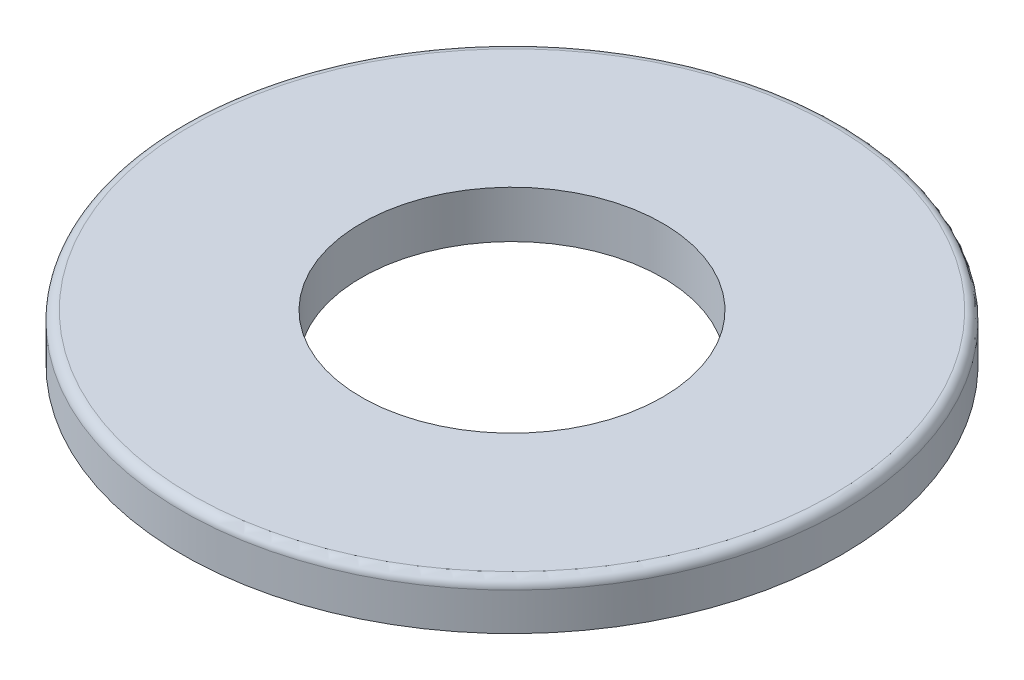
ISO-10303-21;
HEADER;
FILE_DESCRIPTION(('STEP AP214'),'2;1');
FILE_NAME('part.step','',(''),(''),'','','');
FILE_SCHEMA(('AUTOMOTIVE_DESIGN { 1 0 10303 214 1 1 1 1 }'));
ENDSEC;
DATA;
#1=APPLICATION_CONTEXT('core data for automotive mechanical design processes');
#2=APPLICATION_PROTOCOL_DEFINITION('international standard','automotive_design',2000,#1);
#3=PRODUCT_CONTEXT('',#1,'mechanical');
#4=PRODUCT('Part','Part','',(#3));
#5=PRODUCT_RELATED_PRODUCT_CATEGORY('part','',(#4));
#6=PRODUCT_DEFINITION_FORMATION('','',#4);
#7=PRODUCT_DEFINITION_CONTEXT('part definition',#1,'design');
#8=PRODUCT_DEFINITION('design','',#6,#7);
#9=PRODUCT_DEFINITION_SHAPE('','',#8);
#10=(LENGTH_UNIT() NAMED_UNIT(*) SI_UNIT(.MILLI.,.METRE.));
#11=(NAMED_UNIT(*) PLANE_ANGLE_UNIT() SI_UNIT($,.RADIAN.));
#12=(NAMED_UNIT(*) SI_UNIT($,.STERADIAN.) SOLID_ANGLE_UNIT());
#13=UNCERTAINTY_MEASURE_WITH_UNIT(LENGTH_MEASURE(1.E-05),#10,'distance_accuracy_value','');
#14=(GEOMETRIC_REPRESENTATION_CONTEXT(3) GLOBAL_UNCERTAINTY_ASSIGNED_CONTEXT((#13)) GLOBAL_UNIT_ASSIGNED_CONTEXT((#10,
#11,#12)) REPRESENTATION_CONTEXT('',''));
#15=CARTESIAN_POINT('',(0.,0.,0.));
#16=DIRECTION('',(0.,0.,1.));
#17=DIRECTION('',(1.,0.,0.));
#18=AXIS2_PLACEMENT_3D('',#15,#16,#17);
#19=CARTESIAN_POINT('',(0.,0.5,0.));
#20=DIRECTION('',(0.,-1.,0.));
#21=DIRECTION('',(0.,0.,-1.));
#22=AXIS2_PLACEMENT_3D('',#19,#20,#21);
#23=PLANE('',#22);
#24=CARTESIAN_POINT('',(0.,0.5,0.));
#25=DIRECTION('',(0.,1.,0.));
#26=DIRECTION('',(1.,0.,0.));
#27=AXIS2_PLACEMENT_3D('',#24,#25,#26);
#28=CIRCLE('',#27,1.6);
#29=CARTESIAN_POINT('',(1.6,0.5,0.));
#30=VERTEX_POINT('',#29);
#31=EDGE_CURVE('E79',#30,#30,#28,.T.);
#32=ORIENTED_EDGE('',*,*,#31,.F.);
#33=EDGE_LOOP('',(#32));
#34=FACE_BOUND('',#33,.T.);
#35=CARTESIAN_POINT('',(0.,0.5,0.));
#36=DIRECTION('',(0.,1.,0.));
#37=DIRECTION('',(-1.,0.,0.));
#38=AXIS2_PLACEMENT_3D('',#35,#36,#37);
#39=CIRCLE('',#38,3.4);
#40=CARTESIAN_POINT('',(3.39993492896805,0.5,0.0210351796524664));
#41=VERTEX_POINT('',#40);
#42=EDGE_CURVE('E11',#41,#41,#39,.T.);
#43=ORIENTED_EDGE('',*,*,#42,.T.);
#44=EDGE_LOOP('',(#43));
#45=FACE_BOUND('',#44,.T.);
#46=ADVANCED_FACE('F17',(#34,#45),#23,.F.);
#47=CARTESIAN_POINT('',(0.,0.4,0.));
#48=DIRECTION('',(0.,-1.,0.));
#49=DIRECTION('',(-0.999980861461192,0.,-0.00618681754484295));
#50=AXIS2_PLACEMENT_3D('',#47,#48,#49);
#51=TOROIDAL_SURFACE('',#50,3.4,0.1);
#52=CARTESIAN_POINT('',(0.,0.4,0.));
#53=DIRECTION('',(0.,1.,0.));
#54=DIRECTION('',(-1.,0.,0.));
#55=AXIS2_PLACEMENT_3D('',#52,#53,#54);
#56=CIRCLE('',#55,3.5);
#57=CARTESIAN_POINT('',(3.5,0.4,0.));
#58=VERTEX_POINT('',#57);
#59=CARTESIAN_POINT('',(3.49993301511417,0.4,0.0216538614069508));
#60=VERTEX_POINT('',#59);
#61=EDGE_CURVE('E86',#58,#60,#56,.T.);
#62=ORIENTED_EDGE('',*,*,#61,.T.);
#63=CARTESIAN_POINT('',(3.39993492896805,0.4,0.0210351796524664));
#64=DIRECTION('',(-0.00618681754484307,0.,0.999980861461192));
#65=DIRECTION('',(0.999980861461192,0.,0.00618681754484307));
#66=AXIS2_PLACEMENT_3D('',#63,#64,#65);
#67=CIRCLE('',#66,0.1);
#68=EDGE_CURVE('E26',#60,#41,#67,.T.);
#69=ORIENTED_EDGE('',*,*,#68,.T.);
#70=ORIENTED_EDGE('',*,*,#42,.F.);
#71=ORIENTED_EDGE('',*,*,#68,.F.);
#72=CARTESIAN_POINT('',(0.,0.4,0.));
#73=DIRECTION('',(0.,1.,0.));
#74=DIRECTION('',(-1.,0.,0.));
#75=AXIS2_PLACEMENT_3D('',#72,#73,#74);
#76=CIRCLE('',#75,3.5);
#77=EDGE_CURVE('E83',#60,#58,#76,.T.);
#78=ORIENTED_EDGE('',*,*,#77,.T.);
#79=EDGE_LOOP('',(#62,#69,#70,#71,#78));
#80=FACE_BOUND('',#79,.T.);
#81=ADVANCED_FACE('F94',(#80),#51,.T.);
#82=CARTESIAN_POINT('',(0.,0.525,0.));
#83=DIRECTION('',(0.,-1.,0.));
#84=DIRECTION('',(-1.,0.,0.));
#85=AXIS2_PLACEMENT_3D('',#82,#83,#84);
#86=CYLINDRICAL_SURFACE('',#85,3.5);
#87=CARTESIAN_POINT('',(0.,0.,0.));
#88=DIRECTION('',(0.,-1.,0.));
#89=DIRECTION('',(1.,0.,0.));
#90=AXIS2_PLACEMENT_3D('',#87,#88,#89);
#91=CIRCLE('',#90,3.5);
#92=CARTESIAN_POINT('',(3.5,0.,0.));
#93=VERTEX_POINT('',#92);
#94=EDGE_CURVE('E20',#93,#93,#91,.T.);
#95=ORIENTED_EDGE('',*,*,#94,.F.);
#96=DIRECTION('',(0.,1.,0.));
#97=VECTOR('',#96,1.);
#98=CARTESIAN_POINT('',(3.5,0.525,0.));
#99=LINE('',#98,#97);
#100=EDGE_CURVE('E60',#93,#58,#99,.T.);
#101=ORIENTED_EDGE('',*,*,#100,.T.);
#102=ORIENTED_EDGE('',*,*,#77,.F.);
#103=ORIENTED_EDGE('',*,*,#61,.F.);
#104=ORIENTED_EDGE('',*,*,#100,.F.);
#105=EDGE_LOOP('',(#95,#101,#102,#103,#104));
#106=FACE_BOUND('',#105,.T.);
#107=ADVANCED_FACE('F96',(#106),#86,.T.);
#108=CARTESIAN_POINT('',(0.,0.,0.));
#109=DIRECTION('',(0.,-1.,0.));
#110=DIRECTION('',(0.,0.,-1.));
#111=AXIS2_PLACEMENT_3D('',#108,#109,#110);
#112=PLANE('',#111);
#113=CARTESIAN_POINT('',(0.,0.,0.));
#114=DIRECTION('',(0.,-1.,0.));
#115=DIRECTION('',(1.,0.,0.));
#116=AXIS2_PLACEMENT_3D('',#113,#114,#115);
#117=CIRCLE('',#116,1.6);
#118=CARTESIAN_POINT('',(1.6,0.,0.));
#119=VERTEX_POINT('',#118);
#120=EDGE_CURVE('E67',#119,#119,#117,.T.);
#121=ORIENTED_EDGE('',*,*,#120,.F.);
#122=EDGE_LOOP('',(#121));
#123=FACE_BOUND('',#122,.T.);
#124=ORIENTED_EDGE('',*,*,#94,.T.);
#125=EDGE_LOOP('',(#124));
#126=FACE_BOUND('',#125,.T.);
#127=ADVANCED_FACE('F98',(#123,#126),#112,.T.);
#128=CARTESIAN_POINT('',(0.,0.525,0.));
#129=DIRECTION('',(0.,-1.,0.));
#130=DIRECTION('',(-1.,0.,0.));
#131=AXIS2_PLACEMENT_3D('',#128,#129,#130);
#132=CYLINDRICAL_SURFACE('',#131,1.6);
#133=ORIENTED_EDGE('',*,*,#31,.T.);
#134=DIRECTION('',(0.,-1.,0.));
#135=VECTOR('',#134,1.);
#136=CARTESIAN_POINT('',(1.6,0.525,0.));
#137=LINE('',#136,#135);
#138=EDGE_CURVE('E70',#30,#119,#137,.T.);
#139=ORIENTED_EDGE('',*,*,#138,.T.);
#140=ORIENTED_EDGE('',*,*,#120,.T.);
#141=ORIENTED_EDGE('',*,*,#138,.F.);
#142=EDGE_LOOP('',(#133,#139,#140,#141));
#143=FACE_BOUND('',#142,.T.);
#144=ADVANCED_FACE('F69',(#143),#132,.F.);
#145=CLOSED_SHELL('',(#46,#81,#107,#127,#144));
#146=MANIFOLD_SOLID_BREP('B1',#145);
#147=ADVANCED_BREP_SHAPE_REPRESENTATION('',(#18,#146),#14);
#148=SHAPE_DEFINITION_REPRESENTATION(#9,#147);
ENDSEC;
END-ISO-10303-21;
